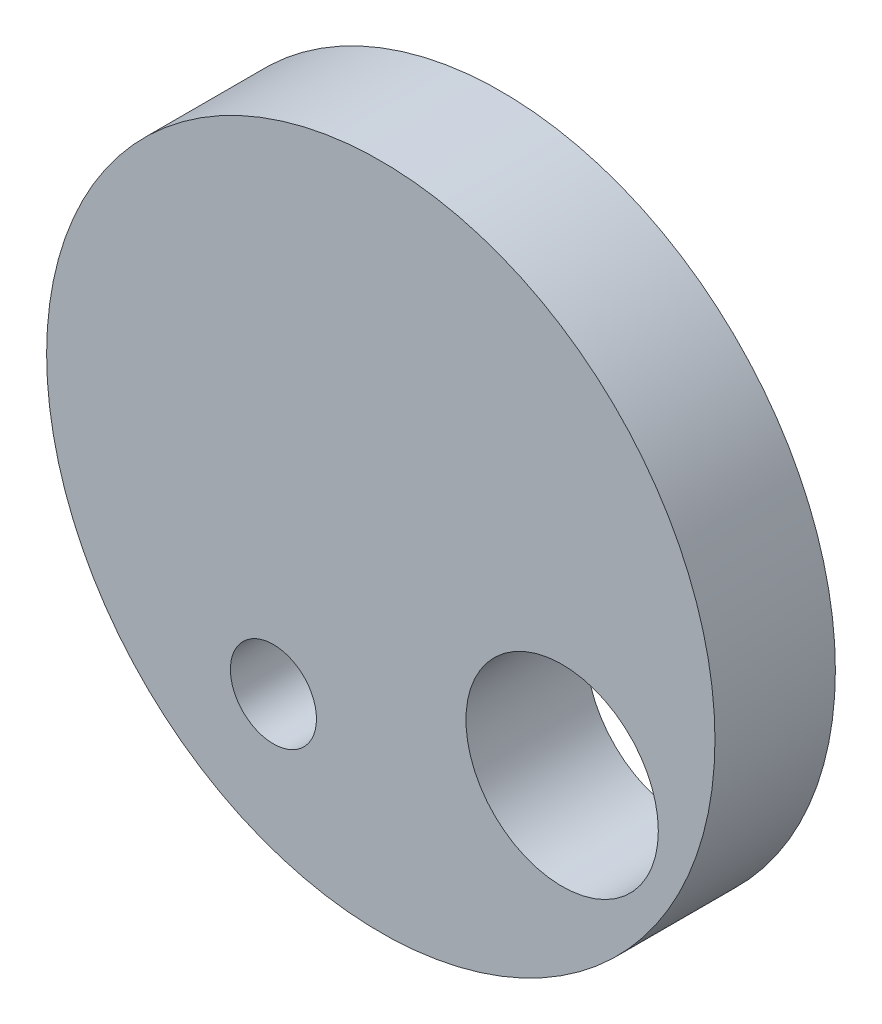
ISO-10303-21;
HEADER;
FILE_DESCRIPTION(('STEP AP214'),'2;1');
FILE_NAME('part.step','',(''),(''),'','','');
FILE_SCHEMA(('AUTOMOTIVE_DESIGN { 1 0 10303 214 1 1 1 1 }'));
ENDSEC;
DATA;
#1=APPLICATION_CONTEXT('core data for automotive mechanical design processes');
#2=APPLICATION_PROTOCOL_DEFINITION('international standard','automotive_design',2000,#1);
#3=PRODUCT_CONTEXT('',#1,'mechanical');
#4=PRODUCT('Part','Part','',(#3));
#5=PRODUCT_RELATED_PRODUCT_CATEGORY('part','',(#4));
#6=PRODUCT_DEFINITION_FORMATION('','',#4);
#7=PRODUCT_DEFINITION_CONTEXT('part definition',#1,'design');
#8=PRODUCT_DEFINITION('design','',#6,#7);
#9=PRODUCT_DEFINITION_SHAPE('','',#8);
#10=(LENGTH_UNIT() NAMED_UNIT(*) SI_UNIT(.MILLI.,.METRE.));
#11=(NAMED_UNIT(*) PLANE_ANGLE_UNIT() SI_UNIT($,.RADIAN.));
#12=(NAMED_UNIT(*) SI_UNIT($,.STERADIAN.) SOLID_ANGLE_UNIT());
#13=UNCERTAINTY_MEASURE_WITH_UNIT(LENGTH_MEASURE(1.E-05),#10,'distance_accuracy_value','');
#14=(GEOMETRIC_REPRESENTATION_CONTEXT(3) GLOBAL_UNCERTAINTY_ASSIGNED_CONTEXT((#13)) GLOBAL_UNIT_ASSIGNED_CONTEXT((#10,
#11,#12)) REPRESENTATION_CONTEXT('',''));
#15=CARTESIAN_POINT('',(0.,0.,0.));
#16=DIRECTION('',(0.,0.,1.));
#17=DIRECTION('',(1.,0.,0.));
#18=AXIS2_PLACEMENT_3D('',#15,#16,#17);
#19=CARTESIAN_POINT('',(0.,0.,20.));
#20=DIRECTION('',(0.,0.,1.));
#21=DIRECTION('',(1.,0.,0.));
#22=AXIS2_PLACEMENT_3D('',#19,#20,#21);
#23=PLANE('',#22);
#24=CARTESIAN_POINT('',(-17.8301816696557,-30.1178455674883,20.));
#25=DIRECTION('',(0.,0.,1.));
#26=DIRECTION('',(1.,0.,0.));
#27=AXIS2_PLACEMENT_3D('',#24,#25,#26);
#28=CIRCLE('',#27,7.14978492215175);
#29=CARTESIAN_POINT('',(-10.6803967475039,-30.1178455674883,20.));
#30=VERTEX_POINT('',#29);
#31=EDGE_CURVE('E41',#30,#30,#28,.T.);
#32=ORIENTED_EDGE('',*,*,#31,.F.);
#33=EDGE_LOOP('',(#32));
#34=FACE_BOUND('',#33,.T.);
#35=CARTESIAN_POINT('',(0.,0.,20.));
#36=DIRECTION('',(0.,0.,1.));
#37=DIRECTION('',(1.,0.,0.));
#38=AXIS2_PLACEMENT_3D('',#35,#36,#37);
#39=CIRCLE('',#38,55.5);
#40=CARTESIAN_POINT('',(55.5,0.,20.));
#41=VERTEX_POINT('',#40);
#42=EDGE_CURVE('E10',#41,#41,#39,.T.);
#43=ORIENTED_EDGE('',*,*,#42,.T.);
#44=EDGE_LOOP('',(#43));
#45=FACE_BOUND('',#44,.T.);
#46=CARTESIAN_POINT('',(30.1178455674883,-17.8301816696558,20.));
#47=DIRECTION('',(0.,0.,1.));
#48=DIRECTION('',(1.,0.,0.));
#49=AXIS2_PLACEMENT_3D('',#46,#47,#48);
#50=CIRCLE('',#49,15.9759826737908);
#51=CARTESIAN_POINT('',(46.093828241279,-17.8301816696558,20.));
#52=VERTEX_POINT('',#51);
#53=EDGE_CURVE('E46',#52,#52,#50,.T.);
#54=ORIENTED_EDGE('',*,*,#53,.F.);
#55=EDGE_LOOP('',(#54));
#56=FACE_BOUND('',#55,.T.);
#57=ADVANCED_FACE('F30',(#34,#45,#56),#23,.T.);
#58=CARTESIAN_POINT('',(0.,0.,0.));
#59=DIRECTION('',(0.,0.,1.));
#60=DIRECTION('',(1.,0.,0.));
#61=AXIS2_PLACEMENT_3D('',#58,#59,#60);
#62=PLANE('',#61);
#63=CARTESIAN_POINT('',(0.,0.,0.));
#64=DIRECTION('',(0.,0.,1.));
#65=DIRECTION('',(1.,0.,0.));
#66=AXIS2_PLACEMENT_3D('',#63,#64,#65);
#67=CIRCLE('',#66,55.5);
#68=CARTESIAN_POINT('',(55.5,0.,0.));
#69=VERTEX_POINT('',#68);
#70=EDGE_CURVE('E34',#69,#69,#67,.T.);
#71=ORIENTED_EDGE('',*,*,#70,.F.);
#72=EDGE_LOOP('',(#71));
#73=FACE_BOUND('',#72,.T.);
#74=CARTESIAN_POINT('',(-17.8301816696557,-30.1178455674883,0.));
#75=DIRECTION('',(0.,0.,1.));
#76=DIRECTION('',(1.,0.,0.));
#77=AXIS2_PLACEMENT_3D('',#74,#75,#76);
#78=CIRCLE('',#77,7.14978492215175);
#79=CARTESIAN_POINT('',(-10.6803967475039,-30.1178455674883,0.));
#80=VERTEX_POINT('',#79);
#81=EDGE_CURVE('E43',#80,#80,#78,.T.);
#82=ORIENTED_EDGE('',*,*,#81,.T.);
#83=EDGE_LOOP('',(#82));
#84=FACE_BOUND('',#83,.T.);
#85=CARTESIAN_POINT('',(30.1178455674883,-17.8301816696558,0.));
#86=DIRECTION('',(0.,0.,1.));
#87=DIRECTION('',(1.,0.,0.));
#88=AXIS2_PLACEMENT_3D('',#85,#86,#87);
#89=CIRCLE('',#88,15.9759826737908);
#90=CARTESIAN_POINT('',(46.093828241279,-17.8301816696558,0.));
#91=VERTEX_POINT('',#90);
#92=EDGE_CURVE('E49',#91,#91,#89,.T.);
#93=ORIENTED_EDGE('',*,*,#92,.T.);
#94=EDGE_LOOP('',(#93));
#95=FACE_BOUND('',#94,.T.);
#96=ADVANCED_FACE('F59',(#73,#84,#95),#62,.F.);
#97=CARTESIAN_POINT('',(0.,0.,20.));
#98=DIRECTION('',(0.,0.,-1.));
#99=DIRECTION('',(-1.,0.,0.));
#100=AXIS2_PLACEMENT_3D('',#97,#98,#99);
#101=CYLINDRICAL_SURFACE('',#100,55.5);
#102=ORIENTED_EDGE('',*,*,#42,.F.);
#103=EDGE_LOOP('',(#102));
#104=FACE_BOUND('',#103,.T.);
#105=ORIENTED_EDGE('',*,*,#70,.T.);
#106=EDGE_LOOP('',(#105));
#107=FACE_BOUND('',#106,.T.);
#108=ADVANCED_FACE('F32',(#104,#107),#101,.T.);
#109=CARTESIAN_POINT('',(-17.8301816696557,-30.1178455674883,20.));
#110=DIRECTION('',(0.,0.,-1.));
#111=DIRECTION('',(-1.,0.,0.));
#112=AXIS2_PLACEMENT_3D('',#109,#110,#111);
#113=CYLINDRICAL_SURFACE('',#112,7.14978492215175);
#114=ORIENTED_EDGE('',*,*,#31,.T.);
#115=EDGE_LOOP('',(#114));
#116=FACE_BOUND('',#115,.T.);
#117=ORIENTED_EDGE('',*,*,#81,.F.);
#118=EDGE_LOOP('',(#117));
#119=FACE_BOUND('',#118,.T.);
#120=ADVANCED_FACE('F68',(#116,#119),#113,.F.);
#121=CARTESIAN_POINT('',(30.1178455674883,-17.8301816696558,20.));
#122=DIRECTION('',(0.,0.,-1.));
#123=DIRECTION('',(-1.,0.,0.));
#124=AXIS2_PLACEMENT_3D('',#121,#122,#123);
#125=CYLINDRICAL_SURFACE('',#124,15.9759826737908);
#126=ORIENTED_EDGE('',*,*,#53,.T.);
#127=EDGE_LOOP('',(#126));
#128=FACE_BOUND('',#127,.T.);
#129=ORIENTED_EDGE('',*,*,#92,.F.);
#130=EDGE_LOOP('',(#129));
#131=FACE_BOUND('',#130,.T.);
#132=ADVANCED_FACE('F55',(#128,#131),#125,.F.);
#133=CLOSED_SHELL('',(#57,#96,#108,#120,#132));
#134=MANIFOLD_SOLID_BREP('B2',#133);
#135=ADVANCED_BREP_SHAPE_REPRESENTATION('',(#18,#134),#14);
#136=SHAPE_DEFINITION_REPRESENTATION(#9,#135);
ENDSEC;
END-ISO-10303-21;
